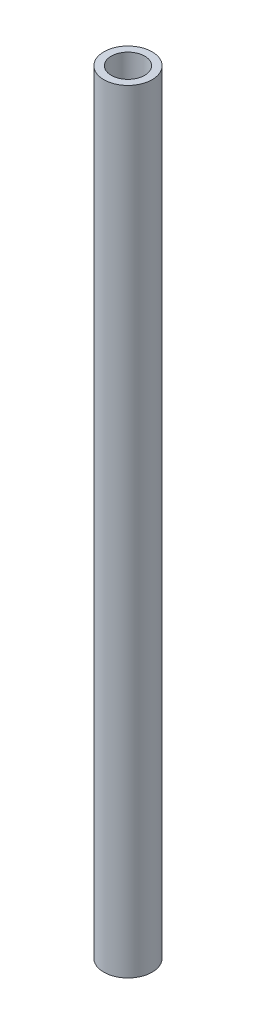
ISO-10303-21;
HEADER;
FILE_DESCRIPTION(('STEP AP214'),'2;1');
FILE_NAME('part.step','',(''),(''),'','','');
FILE_SCHEMA(('AUTOMOTIVE_DESIGN { 1 0 10303 214 1 1 1 1 }'));
ENDSEC;
DATA;
#1=APPLICATION_CONTEXT('core data for automotive mechanical design processes');
#2=APPLICATION_PROTOCOL_DEFINITION('international standard','automotive_design',2000,#1);
#3=PRODUCT_CONTEXT('',#1,'mechanical');
#4=PRODUCT('Part','Part','',(#3));
#5=PRODUCT_RELATED_PRODUCT_CATEGORY('part','',(#4));
#6=PRODUCT_DEFINITION_FORMATION('','',#4);
#7=PRODUCT_DEFINITION_CONTEXT('part definition',#1,'design');
#8=PRODUCT_DEFINITION('design','',#6,#7);
#9=PRODUCT_DEFINITION_SHAPE('','',#8);
#10=(LENGTH_UNIT() NAMED_UNIT(*) SI_UNIT(.MILLI.,.METRE.));
#11=(NAMED_UNIT(*) PLANE_ANGLE_UNIT() SI_UNIT($,.RADIAN.));
#12=(NAMED_UNIT(*) SI_UNIT($,.STERADIAN.) SOLID_ANGLE_UNIT());
#13=UNCERTAINTY_MEASURE_WITH_UNIT(LENGTH_MEASURE(1.E-05),#10,'distance_accuracy_value','');
#14=(GEOMETRIC_REPRESENTATION_CONTEXT(3) GLOBAL_UNCERTAINTY_ASSIGNED_CONTEXT((#13)) GLOBAL_UNIT_ASSIGNED_CONTEXT((#10,
#11,#12)) REPRESENTATION_CONTEXT('',''));
#15=CARTESIAN_POINT('',(0.,0.,0.));
#16=DIRECTION('',(0.,0.,1.));
#17=DIRECTION('',(1.,0.,0.));
#18=AXIS2_PLACEMENT_3D('',#15,#16,#17);
#19=CARTESIAN_POINT('',(0.,0.,0.));
#20=DIRECTION('',(0.,1.,0.));
#21=DIRECTION('',(0.,0.,1.));
#22=AXIS2_PLACEMENT_3D('',#19,#20,#21);
#23=PLANE('',#22);
#24=CARTESIAN_POINT('',(0.,0.,0.));
#25=DIRECTION('',(0.,1.,0.));
#26=DIRECTION('',(0.,0.,1.));
#27=AXIS2_PLACEMENT_3D('',#24,#25,#26);
#28=CIRCLE('',#27,3.175);
#29=CARTESIAN_POINT('',(0.,0.,3.175));
#30=VERTEX_POINT('',#29);
#31=EDGE_CURVE('E41',#30,#30,#28,.T.);
#32=ORIENTED_EDGE('',*,*,#31,.F.);
#33=EDGE_LOOP('',(#32));
#34=FACE_BOUND('',#33,.T.);
#35=CARTESIAN_POINT('',(0.,0.,0.));
#36=DIRECTION('',(0.,1.,0.));
#37=DIRECTION('',(0.,0.,1.));
#38=AXIS2_PLACEMENT_3D('',#35,#36,#37);
#39=CIRCLE('',#38,2.19709999999999);
#40=CARTESIAN_POINT('',(0.,0.,2.19709999999999));
#41=VERTEX_POINT('',#40);
#42=EDGE_CURVE('E50',#41,#41,#39,.F.);
#43=ORIENTED_EDGE('',*,*,#42,.F.);
#44=EDGE_LOOP('',(#43));
#45=FACE_BOUND('',#44,.T.);
#46=ADVANCED_FACE('F37',(#34,#45),#23,.F.);
#47=CARTESIAN_POINT('',(0.,101.6,0.));
#48=DIRECTION('',(0.,-1.,0.));
#49=DIRECTION('',(0.,0.,-1.));
#50=AXIS2_PLACEMENT_3D('',#47,#48,#49);
#51=CYLINDRICAL_SURFACE('',#50,3.175);
#52=CARTESIAN_POINT('',(0.,101.6,0.));
#53=DIRECTION('',(0.,1.,0.));
#54=DIRECTION('',(0.,0.,1.));
#55=AXIS2_PLACEMENT_3D('',#52,#53,#54);
#56=CIRCLE('',#55,3.175);
#57=CARTESIAN_POINT('',(0.,101.6,3.175));
#58=VERTEX_POINT('',#57);
#59=EDGE_CURVE('E10',#58,#58,#56,.T.);
#60=ORIENTED_EDGE('',*,*,#59,.F.);
#61=EDGE_LOOP('',(#60));
#62=FACE_BOUND('',#61,.T.);
#63=ORIENTED_EDGE('',*,*,#31,.T.);
#64=EDGE_LOOP('',(#63));
#65=FACE_BOUND('',#64,.T.);
#66=ADVANCED_FACE('F39',(#62,#65),#51,.T.);
#67=CARTESIAN_POINT('',(0.,101.6,0.));
#68=DIRECTION('',(0.,1.,0.));
#69=DIRECTION('',(0.,0.,1.));
#70=AXIS2_PLACEMENT_3D('',#67,#68,#69);
#71=PLANE('',#70);
#72=CARTESIAN_POINT('',(0.,101.6,0.));
#73=DIRECTION('',(0.,1.,0.));
#74=DIRECTION('',(0.,0.,1.));
#75=AXIS2_PLACEMENT_3D('',#72,#73,#74);
#76=CIRCLE('',#75,2.1971);
#77=CARTESIAN_POINT('',(0.,101.6,2.1971));
#78=VERTEX_POINT('',#77);
#79=EDGE_CURVE('E52',#78,#78,#76,.T.);
#80=ORIENTED_EDGE('',*,*,#79,.F.);
#81=EDGE_LOOP('',(#80));
#82=FACE_BOUND('',#81,.T.);
#83=ORIENTED_EDGE('',*,*,#59,.T.);
#84=EDGE_LOOP('',(#83));
#85=FACE_BOUND('',#84,.T.);
#86=ADVANCED_FACE('F68',(#82,#85),#71,.T.);
#87=CARTESIAN_POINT('',(0.,101.6,0.));
#88=DIRECTION('',(0.,1.,0.));
#89=DIRECTION('',(0.,0.,1.));
#90=AXIS2_PLACEMENT_3D('',#87,#88,#89);
#91=CYLINDRICAL_SURFACE('',#90,2.19709999999999);
#92=ORIENTED_EDGE('',*,*,#42,.T.);
#93=EDGE_LOOP('',(#92));
#94=FACE_BOUND('',#93,.T.);
#95=ORIENTED_EDGE('',*,*,#79,.T.);
#96=EDGE_LOOP('',(#95));
#97=FACE_BOUND('',#96,.T.);
#98=ADVANCED_FACE('F60',(#94,#97),#91,.F.);
#99=CLOSED_SHELL('',(#46,#66,#86,#98));
#100=MANIFOLD_SOLID_BREP('B2',#99);
#101=ADVANCED_BREP_SHAPE_REPRESENTATION('',(#18,#100),#14);
#102=SHAPE_DEFINITION_REPRESENTATION(#9,#101);
ENDSEC;
END-ISO-10303-21;
